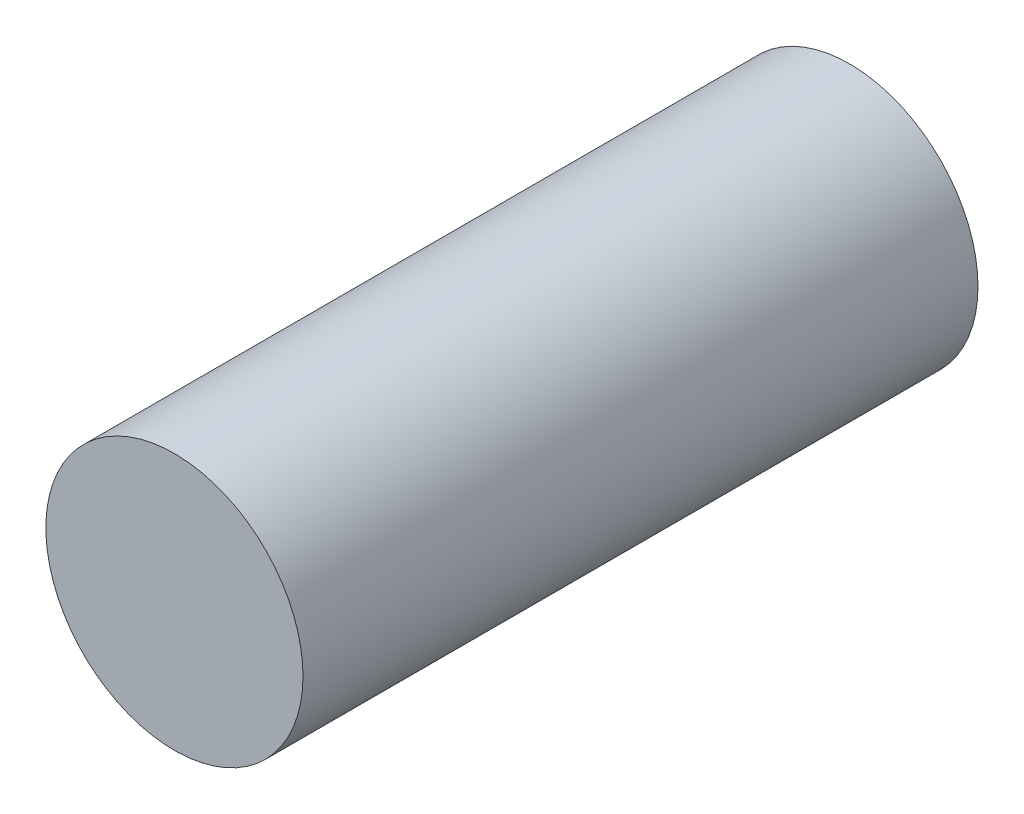
ISO-10303-21;
HEADER;
FILE_DESCRIPTION(('STEP AP214'),'2;1');
FILE_NAME('part.step','',(''),(''),'','','');
FILE_SCHEMA(('AUTOMOTIVE_DESIGN { 1 0 10303 214 1 1 1 1 }'));
ENDSEC;
DATA;
#1=APPLICATION_CONTEXT('core data for automotive mechanical design processes');
#2=APPLICATION_PROTOCOL_DEFINITION('international standard','automotive_design',2000,#1);
#3=PRODUCT_CONTEXT('',#1,'mechanical');
#4=PRODUCT('Part','Part','',(#3));
#5=PRODUCT_RELATED_PRODUCT_CATEGORY('part','',(#4));
#6=PRODUCT_DEFINITION_FORMATION('','',#4);
#7=PRODUCT_DEFINITION_CONTEXT('part definition',#1,'design');
#8=PRODUCT_DEFINITION('design','',#6,#7);
#9=PRODUCT_DEFINITION_SHAPE('','',#8);
#10=(LENGTH_UNIT() NAMED_UNIT(*) SI_UNIT(.MILLI.,.METRE.));
#11=(NAMED_UNIT(*) PLANE_ANGLE_UNIT() SI_UNIT($,.RADIAN.));
#12=(NAMED_UNIT(*) SI_UNIT($,.STERADIAN.) SOLID_ANGLE_UNIT());
#13=UNCERTAINTY_MEASURE_WITH_UNIT(LENGTH_MEASURE(1.E-05),#10,'distance_accuracy_value','');
#14=(GEOMETRIC_REPRESENTATION_CONTEXT(3) GLOBAL_UNCERTAINTY_ASSIGNED_CONTEXT((#13)) GLOBAL_UNIT_ASSIGNED_CONTEXT((#10,
#11,#12)) REPRESENTATION_CONTEXT('',''));
#15=CARTESIAN_POINT('',(0.,0.,0.));
#16=DIRECTION('',(0.,0.,1.));
#17=DIRECTION('',(1.,0.,0.));
#18=AXIS2_PLACEMENT_3D('',#15,#16,#17);
#19=CARTESIAN_POINT('',(0.,0.,6.3000001));
#20=DIRECTION('',(0.,0.,1.));
#21=DIRECTION('',(1.,0.,0.));
#22=AXIS2_PLACEMENT_3D('',#19,#20,#21);
#23=PLANE('',#22);
#24=CARTESIAN_POINT('',(0.,0.,6.3000001));
#25=DIRECTION('',(0.,0.,1.));
#26=DIRECTION('',(1.,0.,0.));
#27=AXIS2_PLACEMENT_3D('',#24,#25,#26);
#28=CIRCLE('',#27,1.20000014);
#29=CARTESIAN_POINT('',(1.20000014,0.,6.3000001));
#30=VERTEX_POINT('',#29);
#31=EDGE_CURVE('E10',#30,#30,#28,.T.);
#32=ORIENTED_EDGE('',*,*,#31,.T.);
#33=EDGE_LOOP('',(#32));
#34=FACE_BOUND('',#33,.T.);
#35=ADVANCED_FACE('F15',(#34),#23,.T.);
#36=CARTESIAN_POINT('',(0.,0.,0.));
#37=DIRECTION('',(0.,0.,1.));
#38=DIRECTION('',(1.,0.,0.));
#39=AXIS2_PLACEMENT_3D('',#36,#37,#38);
#40=PLANE('',#39);
#41=CARTESIAN_POINT('',(0.,0.,0.));
#42=DIRECTION('',(0.,0.,1.));
#43=DIRECTION('',(1.,0.,0.));
#44=AXIS2_PLACEMENT_3D('',#41,#42,#43);
#45=CIRCLE('',#44,1.20000014);
#46=CARTESIAN_POINT('',(1.20000014,0.,0.));
#47=VERTEX_POINT('',#46);
#48=EDGE_CURVE('E22',#47,#47,#45,.T.);
#49=ORIENTED_EDGE('',*,*,#48,.F.);
#50=EDGE_LOOP('',(#49));
#51=FACE_BOUND('',#50,.T.);
#52=ADVANCED_FACE('F37',(#51),#40,.F.);
#53=CARTESIAN_POINT('',(0.,0.,0.));
#54=DIRECTION('',(0.,0.,-1.));
#55=DIRECTION('',(1.,0.,0.));
#56=AXIS2_PLACEMENT_3D('',#53,#54,#55);
#57=CYLINDRICAL_SURFACE('',#56,1.20000014);
#58=ORIENTED_EDGE('',*,*,#31,.F.);
#59=EDGE_LOOP('',(#58));
#60=FACE_BOUND('',#59,.T.);
#61=ORIENTED_EDGE('',*,*,#48,.T.);
#62=EDGE_LOOP('',(#61));
#63=FACE_BOUND('',#62,.T.);
#64=ADVANCED_FACE('F35',(#60,#63),#57,.T.);
#65=CLOSED_SHELL('',(#35,#52,#64));
#66=MANIFOLD_SOLID_BREP('B1',#65);
#67=ADVANCED_BREP_SHAPE_REPRESENTATION('',(#18,#66),#14);
#68=SHAPE_DEFINITION_REPRESENTATION(#9,#67);
ENDSEC;
END-ISO-10303-21;
